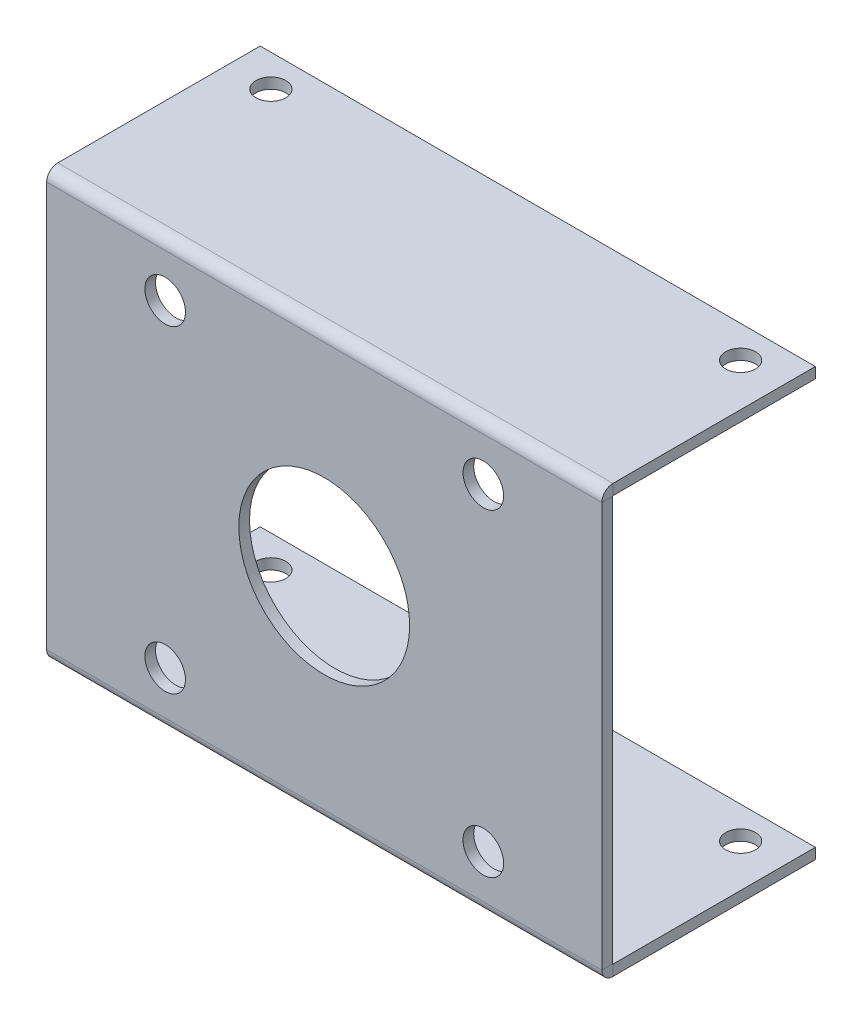
ISO-10303-21;
HEADER;
FILE_DESCRIPTION(('STEP AP214'),'2;1');
FILE_NAME('part.step','',(''),(''),'','','');
FILE_SCHEMA(('AUTOMOTIVE_DESIGN { 1 0 10303 214 1 1 1 1 }'));
ENDSEC;
DATA;
#1=APPLICATION_CONTEXT('core data for automotive mechanical design processes');
#2=APPLICATION_PROTOCOL_DEFINITION('international standard','automotive_design',2000,#1);
#3=PRODUCT_CONTEXT('',#1,'mechanical');
#4=PRODUCT('Part','Part','',(#3));
#5=PRODUCT_RELATED_PRODUCT_CATEGORY('part','',(#4));
#6=PRODUCT_DEFINITION_FORMATION('','',#4);
#7=PRODUCT_DEFINITION_CONTEXT('part definition',#1,'design');
#8=PRODUCT_DEFINITION('design','',#6,#7);
#9=PRODUCT_DEFINITION_SHAPE('','',#8);
#10=(LENGTH_UNIT() NAMED_UNIT(*) SI_UNIT(.MILLI.,.METRE.));
#11=(NAMED_UNIT(*) PLANE_ANGLE_UNIT() SI_UNIT($,.RADIAN.));
#12=(NAMED_UNIT(*) SI_UNIT($,.STERADIAN.) SOLID_ANGLE_UNIT());
#13=UNCERTAINTY_MEASURE_WITH_UNIT(LENGTH_MEASURE(1.E-05),#10,'distance_accuracy_value','');
#14=(GEOMETRIC_REPRESENTATION_CONTEXT(3) GLOBAL_UNCERTAINTY_ASSIGNED_CONTEXT((#13)) GLOBAL_UNIT_ASSIGNED_CONTEXT((#10,
#11,#12)) REPRESENTATION_CONTEXT('',''));
#15=CARTESIAN_POINT('',(0.,0.,0.));
#16=DIRECTION('',(0.,0.,1.));
#17=DIRECTION('',(1.,0.,0.));
#18=AXIS2_PLACEMENT_3D('',#15,#16,#17);
#19=CARTESIAN_POINT('',(0.,0.,-5.));
#20=DIRECTION('',(0.,0.,-1.));
#21=DIRECTION('',(-1.,0.,0.));
#22=AXIS2_PLACEMENT_3D('',#19,#20,#21);
#23=PLANE('',#22);
#24=CARTESIAN_POINT('',(74.5,-74.5,-5.));
#25=DIRECTION('',(0.,0.,-1.));
#26=DIRECTION('',(-1.,0.,0.));
#27=AXIS2_PLACEMENT_3D('',#24,#25,#26);
#28=CIRCLE('',#27,9.49999999999999);
#29=CARTESIAN_POINT('',(65.,-74.5,-5.));
#30=VERTEX_POINT('',#29);
#31=EDGE_CURVE('E297',#30,#30,#28,.T.);
#32=ORIENTED_EDGE('',*,*,#31,.F.);
#33=EDGE_LOOP('',(#32));
#34=FACE_BOUND('',#33,.T.);
#35=CARTESIAN_POINT('',(-74.5,-74.5,-5.));
#36=DIRECTION('',(0.,0.,-1.));
#37=DIRECTION('',(-1.,0.,0.));
#38=AXIS2_PLACEMENT_3D('',#35,#36,#37);
#39=CIRCLE('',#38,9.49999999999999);
#40=CARTESIAN_POINT('',(-84.,-74.5,-5.));
#41=VERTEX_POINT('',#40);
#42=EDGE_CURVE('E310',#41,#41,#39,.T.);
#43=ORIENTED_EDGE('',*,*,#42,.F.);
#44=EDGE_LOOP('',(#43));
#45=FACE_BOUND('',#44,.T.);
#46=CARTESIAN_POINT('',(-74.5,74.5,-5.));
#47=DIRECTION('',(0.,0.,-1.));
#48=DIRECTION('',(-1.,0.,0.));
#49=AXIS2_PLACEMENT_3D('',#46,#47,#48);
#50=CIRCLE('',#49,9.49999999999999);
#51=CARTESIAN_POINT('',(-84.,74.5,-5.));
#52=VERTEX_POINT('',#51);
#53=EDGE_CURVE('E306',#52,#52,#50,.T.);
#54=ORIENTED_EDGE('',*,*,#53,.F.);
#55=EDGE_LOOP('',(#54));
#56=FACE_BOUND('',#55,.T.);
#57=CARTESIAN_POINT('',(74.5,74.5,-5.));
#58=DIRECTION('',(0.,0.,-1.));
#59=DIRECTION('',(-1.,0.,0.));
#60=AXIS2_PLACEMENT_3D('',#57,#58,#59);
#61=CIRCLE('',#60,9.49999999999999);
#62=CARTESIAN_POINT('',(65.,74.5,-5.));
#63=VERTEX_POINT('',#62);
#64=EDGE_CURVE('E301',#63,#63,#61,.T.);
#65=ORIENTED_EDGE('',*,*,#64,.F.);
#66=EDGE_LOOP('',(#65));
#67=FACE_BOUND('',#66,.T.);
#68=CARTESIAN_POINT('',(0.,0.,-5.));
#69=DIRECTION('',(0.,0.,-1.));
#70=DIRECTION('',(-1.,0.,0.));
#71=AXIS2_PLACEMENT_3D('',#68,#69,#70);
#72=CIRCLE('',#71,40.);
#73=CARTESIAN_POINT('',(-40.,0.,-5.));
#74=VERTEX_POINT('',#73);
#75=EDGE_CURVE('E213',#74,#74,#72,.T.);
#76=ORIENTED_EDGE('',*,*,#75,.F.);
#77=EDGE_LOOP('',(#76));
#78=FACE_BOUND('',#77,.T.);
#79=DIRECTION('',(0.,1.,0.));
#80=VECTOR('',#79,1.);
#81=CARTESIAN_POINT('',(130.,-100.,-5.));
#82=LINE('',#81,#80);
#83=CARTESIAN_POINT('',(130.,-94.8,-5.00000000000001));
#84=VERTEX_POINT('',#83);
#85=CARTESIAN_POINT('',(130.,94.8,-5.));
#86=VERTEX_POINT('',#85);
#87=EDGE_CURVE('E88',#84,#86,#82,.T.);
#88=ORIENTED_EDGE('',*,*,#87,.F.);
#89=DIRECTION('',(-1.,0.,0.));
#90=VECTOR('',#89,1.);
#91=CARTESIAN_POINT('',(-130.,-94.8,-5.00000000000001));
#92=LINE('',#91,#90);
#93=CARTESIAN_POINT('',(-130.,-94.8,-5.00000000000001));
#94=VERTEX_POINT('',#93);
#95=EDGE_CURVE('E226',#94,#84,#92,.F.);
#96=ORIENTED_EDGE('',*,*,#95,.F.);
#97=DIRECTION('',(0.,-1.,0.));
#98=VECTOR('',#97,1.);
#99=CARTESIAN_POINT('',(-130.,-100.,-5.));
#100=LINE('',#99,#98);
#101=CARTESIAN_POINT('',(-130.,94.8,-5.));
#102=VERTEX_POINT('',#101);
#103=EDGE_CURVE('E13',#102,#94,#100,.T.);
#104=ORIENTED_EDGE('',*,*,#103,.F.);
#105=DIRECTION('',(1.,0.,0.));
#106=VECTOR('',#105,1.);
#107=CARTESIAN_POINT('',(130.,94.8,-5.00000000000001));
#108=LINE('',#107,#106);
#109=EDGE_CURVE('E282',#86,#102,#108,.F.);
#110=ORIENTED_EDGE('',*,*,#109,.F.);
#111=EDGE_LOOP('',(#88,#96,#104,#110));
#112=FACE_BOUND('',#111,.T.);
#113=ADVANCED_FACE('F79',(#34,#45,#56,#67,#78,#112),#23,.T.);
#114=CARTESIAN_POINT('',(0.,0.,0.));
#115=DIRECTION('',(0.,0.,-1.));
#116=DIRECTION('',(-1.,0.,0.));
#117=AXIS2_PLACEMENT_3D('',#114,#115,#116);
#118=PLANE('',#117);
#119=CARTESIAN_POINT('',(74.5,-74.5,0.));
#120=DIRECTION('',(0.,0.,-1.));
#121=DIRECTION('',(-1.,0.,0.));
#122=AXIS2_PLACEMENT_3D('',#119,#120,#121);
#123=CIRCLE('',#122,9.49999999999999);
#124=CARTESIAN_POINT('',(65.,-74.5,0.));
#125=VERTEX_POINT('',#124);
#126=EDGE_CURVE('E311',#125,#125,#123,.T.);
#127=ORIENTED_EDGE('',*,*,#126,.T.);
#128=EDGE_LOOP('',(#127));
#129=FACE_BOUND('',#128,.T.);
#130=CARTESIAN_POINT('',(-74.5,-74.5,0.));
#131=DIRECTION('',(0.,0.,-1.));
#132=DIRECTION('',(-1.,0.,0.));
#133=AXIS2_PLACEMENT_3D('',#130,#131,#132);
#134=CIRCLE('',#133,9.49999999999999);
#135=CARTESIAN_POINT('',(-84.,-74.5,0.));
#136=VERTEX_POINT('',#135);
#137=EDGE_CURVE('E307',#136,#136,#134,.T.);
#138=ORIENTED_EDGE('',*,*,#137,.T.);
#139=EDGE_LOOP('',(#138));
#140=FACE_BOUND('',#139,.T.);
#141=CARTESIAN_POINT('',(-74.5,74.5,0.));
#142=DIRECTION('',(0.,0.,-1.));
#143=DIRECTION('',(-1.,0.,0.));
#144=AXIS2_PLACEMENT_3D('',#141,#142,#143);
#145=CIRCLE('',#144,9.49999999999999);
#146=CARTESIAN_POINT('',(-84.,74.5,0.));
#147=VERTEX_POINT('',#146);
#148=EDGE_CURVE('E303',#147,#147,#145,.T.);
#149=ORIENTED_EDGE('',*,*,#148,.T.);
#150=EDGE_LOOP('',(#149));
#151=FACE_BOUND('',#150,.T.);
#152=CARTESIAN_POINT('',(74.5,74.5,0.));
#153=DIRECTION('',(0.,0.,-1.));
#154=DIRECTION('',(-1.,0.,0.));
#155=AXIS2_PLACEMENT_3D('',#152,#153,#154);
#156=CIRCLE('',#155,9.49999999999999);
#157=CARTESIAN_POINT('',(65.,74.5,0.));
#158=VERTEX_POINT('',#157);
#159=EDGE_CURVE('E298',#158,#158,#156,.T.);
#160=ORIENTED_EDGE('',*,*,#159,.T.);
#161=EDGE_LOOP('',(#160));
#162=FACE_BOUND('',#161,.T.);
#163=CARTESIAN_POINT('',(0.,0.,0.));
#164=DIRECTION('',(0.,0.,-1.));
#165=DIRECTION('',(-1.,0.,0.));
#166=AXIS2_PLACEMENT_3D('',#163,#164,#165);
#167=CIRCLE('',#166,40.);
#168=CARTESIAN_POINT('',(-40.,0.,0.));
#169=VERTEX_POINT('',#168);
#170=EDGE_CURVE('E294',#169,#169,#167,.T.);
#171=ORIENTED_EDGE('',*,*,#170,.T.);
#172=EDGE_LOOP('',(#171));
#173=FACE_BOUND('',#172,.T.);
#174=DIRECTION('',(-1.,0.,0.));
#175=VECTOR('',#174,1.);
#176=CARTESIAN_POINT('',(-130.,-94.8,0.));
#177=LINE('',#176,#175);
#178=CARTESIAN_POINT('',(-130.,-94.8,0.));
#179=VERTEX_POINT('',#178);
#180=CARTESIAN_POINT('',(130.,-94.8,0.));
#181=VERTEX_POINT('',#180);
#182=EDGE_CURVE('E214',#179,#181,#177,.F.);
#183=ORIENTED_EDGE('',*,*,#182,.T.);
#184=DIRECTION('',(0.,1.,0.));
#185=VECTOR('',#184,1.);
#186=CARTESIAN_POINT('',(130.,-100.,0.));
#187=LINE('',#186,#185);
#188=CARTESIAN_POINT('',(130.,94.8,0.));
#189=VERTEX_POINT('',#188);
#190=EDGE_CURVE('E288',#181,#189,#187,.T.);
#191=ORIENTED_EDGE('',*,*,#190,.T.);
#192=DIRECTION('',(1.,0.,0.));
#193=VECTOR('',#192,1.);
#194=CARTESIAN_POINT('',(130.,94.8,0.));
#195=LINE('',#194,#193);
#196=CARTESIAN_POINT('',(-130.,94.8,0.));
#197=VERTEX_POINT('',#196);
#198=EDGE_CURVE('E270',#189,#197,#195,.F.);
#199=ORIENTED_EDGE('',*,*,#198,.T.);
#200=DIRECTION('',(0.,-1.,0.));
#201=VECTOR('',#200,1.);
#202=CARTESIAN_POINT('',(-130.,-100.,0.));
#203=LINE('',#202,#201);
#204=EDGE_CURVE('E290',#197,#179,#203,.T.);
#205=ORIENTED_EDGE('',*,*,#204,.T.);
#206=EDGE_LOOP('',(#183,#191,#199,#205));
#207=FACE_BOUND('',#206,.T.);
#208=ADVANCED_FACE('F372',(#129,#140,#151,#162,#173,#207),#118,.F.);
#209=CARTESIAN_POINT('',(-130.,-100.,-5.));
#210=DIRECTION('',(-1.,0.,0.));
#211=DIRECTION('',(0.,0.,1.));
#212=AXIS2_PLACEMENT_3D('',#209,#210,#211);
#213=PLANE('',#212);
#214=ORIENTED_EDGE('',*,*,#103,.T.);
#215=DIRECTION('',(0.,0.,1.));
#216=VECTOR('',#215,1.);
#217=CARTESIAN_POINT('',(-130.,-94.8,-5.00000000000001));
#218=LINE('',#217,#216);
#219=EDGE_CURVE('E220',#94,#179,#218,.T.);
#220=ORIENTED_EDGE('',*,*,#219,.T.);
#221=ORIENTED_EDGE('',*,*,#204,.F.);
#222=DIRECTION('',(0.,0.,1.));
#223=VECTOR('',#222,1.);
#224=CARTESIAN_POINT('',(-130.,94.8,-5.00000000000001));
#225=LINE('',#224,#223);
#226=EDGE_CURVE('E95',#102,#197,#225,.T.);
#227=ORIENTED_EDGE('',*,*,#226,.F.);
#228=EDGE_LOOP('',(#214,#220,#221,#227));
#229=FACE_BOUND('',#228,.T.);
#230=ADVANCED_FACE('F378',(#229),#213,.T.);
#231=CARTESIAN_POINT('',(130.,-100.,-5.));
#232=DIRECTION('',(1.,0.,0.));
#233=DIRECTION('',(0.,0.,-1.));
#234=AXIS2_PLACEMENT_3D('',#231,#232,#233);
#235=PLANE('',#234);
#236=DIRECTION('',(0.,0.,1.));
#237=VECTOR('',#236,1.);
#238=CARTESIAN_POINT('',(130.,-94.8,-5.00000000000001));
#239=LINE('',#238,#237);
#240=EDGE_CURVE('E232',#84,#181,#239,.T.);
#241=ORIENTED_EDGE('',*,*,#240,.F.);
#242=ORIENTED_EDGE('',*,*,#87,.T.);
#243=DIRECTION('',(0.,0.,1.));
#244=VECTOR('',#243,1.);
#245=CARTESIAN_POINT('',(130.,94.8,-5.00000000000001));
#246=LINE('',#245,#244);
#247=EDGE_CURVE('E276',#86,#189,#246,.T.);
#248=ORIENTED_EDGE('',*,*,#247,.T.);
#249=ORIENTED_EDGE('',*,*,#190,.F.);
#250=EDGE_LOOP('',(#241,#242,#248,#249));
#251=FACE_BOUND('',#250,.T.);
#252=ADVANCED_FACE('F81',(#251),#235,.T.);
#253=CARTESIAN_POINT('',(-130.,94.8,-5.20000000000001));
#254=DIRECTION('',(-1.,0.,0.));
#255=DIRECTION('',(0.,0.,1.));
#256=AXIS2_PLACEMENT_3D('',#253,#254,#255);
#257=PLANE('',#256);
#258=DIRECTION('',(0.,1.,0.));
#259=VECTOR('',#258,1.);
#260=CARTESIAN_POINT('',(-130.,100.,-5.2));
#261=LINE('',#260,#259);
#262=CARTESIAN_POINT('',(-130.,95.,-5.20000000000001));
#263=VERTEX_POINT('',#262);
#264=CARTESIAN_POINT('',(-130.,100.,-5.19999999999999));
#265=VERTEX_POINT('',#264);
#266=EDGE_CURVE('E235',#263,#265,#261,.T.);
#267=ORIENTED_EDGE('',*,*,#266,.F.);
#268=CARTESIAN_POINT('',(-130.,94.8,-5.20000000000001));
#269=DIRECTION('',(1.,0.,0.));
#270=DIRECTION('',(0.,0.,-1.));
#271=AXIS2_PLACEMENT_3D('',#268,#269,#270);
#272=CIRCLE('',#271,0.200000000000006);
#273=EDGE_CURVE('E279',#102,#263,#272,.F.);
#274=ORIENTED_EDGE('',*,*,#273,.F.);
#275=ORIENTED_EDGE('',*,*,#226,.T.);
#276=CARTESIAN_POINT('',(-130.,94.8,-5.20000000000001));
#277=DIRECTION('',(1.,0.,0.));
#278=DIRECTION('',(0.,0.,-1.));
#279=AXIS2_PLACEMENT_3D('',#276,#277,#278);
#280=CIRCLE('',#279,5.20000000000001);
#281=EDGE_CURVE('E272',#197,#265,#280,.F.);
#282=ORIENTED_EDGE('',*,*,#281,.T.);
#283=EDGE_LOOP('',(#267,#274,#275,#282));
#284=FACE_BOUND('',#283,.T.);
#285=ADVANCED_FACE('F390',(#284),#257,.T.);
#286=CARTESIAN_POINT('',(130.,94.8,-5.20000000000001));
#287=DIRECTION('',(-1.,0.,0.));
#288=DIRECTION('',(0.,0.,1.));
#289=AXIS2_PLACEMENT_3D('',#286,#287,#288);
#290=PLANE('',#289);
#291=CARTESIAN_POINT('',(130.,94.8,-5.20000000000001));
#292=DIRECTION('',(1.,0.,0.));
#293=DIRECTION('',(0.,0.,-1.));
#294=AXIS2_PLACEMENT_3D('',#291,#292,#293);
#295=CIRCLE('',#294,0.200000000000006);
#296=CARTESIAN_POINT('',(130.,95.,-5.20000000000001));
#297=VERTEX_POINT('',#296);
#298=EDGE_CURVE('E240',#297,#86,#295,.T.);
#299=ORIENTED_EDGE('',*,*,#298,.F.);
#300=DIRECTION('',(0.,1.,0.));
#301=VECTOR('',#300,1.);
#302=CARTESIAN_POINT('',(130.,95.,-5.20000000000001));
#303=LINE('',#302,#301);
#304=CARTESIAN_POINT('',(130.,100.,-5.19999999999999));
#305=VERTEX_POINT('',#304);
#306=EDGE_CURVE('E263',#297,#305,#303,.T.);
#307=ORIENTED_EDGE('',*,*,#306,.T.);
#308=CARTESIAN_POINT('',(130.,94.8,-5.20000000000001));
#309=DIRECTION('',(1.,0.,0.));
#310=DIRECTION('',(0.,0.,-1.));
#311=AXIS2_PLACEMENT_3D('',#308,#309,#310);
#312=CIRCLE('',#311,5.20000000000001);
#313=EDGE_CURVE('E273',#305,#189,#312,.T.);
#314=ORIENTED_EDGE('',*,*,#313,.T.);
#315=ORIENTED_EDGE('',*,*,#247,.F.);
#316=EDGE_LOOP('',(#299,#307,#314,#315));
#317=FACE_BOUND('',#316,.T.);
#318=ADVANCED_FACE('F384',(#317),#290,.F.);
#319=CARTESIAN_POINT('',(130.,94.8,-5.20000000000001));
#320=DIRECTION('',(1.,0.,0.));
#321=DIRECTION('',(0.,1.,0.));
#322=AXIS2_PLACEMENT_3D('',#319,#320,#321);
#323=CYLINDRICAL_SURFACE('',#322,5.20000000000001);
#324=ORIENTED_EDGE('',*,*,#198,.F.);
#325=ORIENTED_EDGE('',*,*,#313,.F.);
#326=DIRECTION('',(1.,0.,0.));
#327=VECTOR('',#326,1.);
#328=CARTESIAN_POINT('',(0.,100.,-5.19999999999999));
#329=LINE('',#328,#327);
#330=EDGE_CURVE('E260',#265,#305,#329,.T.);
#331=ORIENTED_EDGE('',*,*,#330,.F.);
#332=ORIENTED_EDGE('',*,*,#281,.F.);
#333=EDGE_LOOP('',(#324,#325,#331,#332));
#334=FACE_BOUND('',#333,.T.);
#335=ADVANCED_FACE('F423',(#334),#323,.T.);
#336=CARTESIAN_POINT('',(130.,94.8,-5.20000000000001));
#337=DIRECTION('',(1.,0.,0.));
#338=DIRECTION('',(0.,1.,0.));
#339=AXIS2_PLACEMENT_3D('',#336,#337,#338);
#340=CYLINDRICAL_SURFACE('',#339,0.200000000000006);
#341=ORIENTED_EDGE('',*,*,#109,.T.);
#342=ORIENTED_EDGE('',*,*,#273,.T.);
#343=DIRECTION('',(-1.,0.,0.));
#344=VECTOR('',#343,1.);
#345=CARTESIAN_POINT('',(-130.,95.,-5.20000000000001));
#346=LINE('',#345,#344);
#347=EDGE_CURVE('E266',#263,#297,#346,.F.);
#348=ORIENTED_EDGE('',*,*,#347,.T.);
#349=ORIENTED_EDGE('',*,*,#298,.T.);
#350=EDGE_LOOP('',(#341,#342,#348,#349));
#351=FACE_BOUND('',#350,.T.);
#352=ADVANCED_FACE('F396',(#351),#340,.F.);
#353=CARTESIAN_POINT('',(130.,100.,-4.99999999999998));
#354=DIRECTION('',(1.,0.,0.));
#355=DIRECTION('',(0.,0.,-1.));
#356=AXIS2_PLACEMENT_3D('',#353,#354,#355);
#357=PLANE('',#356);
#358=DIRECTION('',(0.,0.,1.));
#359=VECTOR('',#358,1.);
#360=CARTESIAN_POINT('',(130.,100.,-4.99999999999998));
#361=LINE('',#360,#359);
#362=CARTESIAN_POINT('',(130.,100.,-100.));
#363=VERTEX_POINT('',#362);
#364=EDGE_CURVE('E244',#363,#305,#361,.T.);
#365=ORIENTED_EDGE('',*,*,#364,.T.);
#366=ORIENTED_EDGE('',*,*,#306,.F.);
#367=DIRECTION('',(0.,0.,-1.));
#368=VECTOR('',#367,1.);
#369=CARTESIAN_POINT('',(130.,95.,3.5059674461847E-13));
#370=LINE('',#369,#368);
#371=CARTESIAN_POINT('',(130.,95.0000000000003,-100.));
#372=VERTEX_POINT('',#371);
#373=EDGE_CURVE('E252',#372,#297,#370,.F.);
#374=ORIENTED_EDGE('',*,*,#373,.F.);
#375=DIRECTION('',(0.,-1.,0.));
#376=VECTOR('',#375,1.);
#377=CARTESIAN_POINT('',(130.,100.,-100.));
#378=LINE('',#377,#376);
#379=EDGE_CURVE('E238',#363,#372,#378,.T.);
#380=ORIENTED_EDGE('',*,*,#379,.F.);
#381=EDGE_LOOP('',(#365,#366,#374,#380));
#382=FACE_BOUND('',#381,.T.);
#383=ADVANCED_FACE('F418',(#382),#357,.T.);
#384=CARTESIAN_POINT('',(-130.,100.,-100.));
#385=DIRECTION('',(-1.,0.,0.));
#386=DIRECTION('',(0.,0.,1.));
#387=AXIS2_PLACEMENT_3D('',#384,#385,#386);
#388=PLANE('',#387);
#389=DIRECTION('',(0.,0.,1.));
#390=VECTOR('',#389,1.);
#391=CARTESIAN_POINT('',(-130.,95.,3.5059674461847E-13));
#392=LINE('',#391,#390);
#393=CARTESIAN_POINT('',(-130.,95.0000000000003,-100.));
#394=VERTEX_POINT('',#393);
#395=EDGE_CURVE('E258',#263,#394,#392,.F.);
#396=ORIENTED_EDGE('',*,*,#395,.F.);
#397=ORIENTED_EDGE('',*,*,#266,.T.);
#398=DIRECTION('',(0.,0.,-1.));
#399=VECTOR('',#398,1.);
#400=CARTESIAN_POINT('',(-130.,100.,-100.));
#401=LINE('',#400,#399);
#402=CARTESIAN_POINT('',(-130.,100.,-100.));
#403=VERTEX_POINT('',#402);
#404=EDGE_CURVE('E250',#265,#403,#401,.T.);
#405=ORIENTED_EDGE('',*,*,#404,.T.);
#406=DIRECTION('',(0.,-1.,0.));
#407=VECTOR('',#406,1.);
#408=CARTESIAN_POINT('',(-130.,100.,-100.));
#409=LINE('',#408,#407);
#410=EDGE_CURVE('E241',#403,#394,#409,.T.);
#411=ORIENTED_EDGE('',*,*,#410,.T.);
#412=EDGE_LOOP('',(#396,#397,#405,#411));
#413=FACE_BOUND('',#412,.T.);
#414=ADVANCED_FACE('F404',(#413),#388,.T.);
#415=CARTESIAN_POINT('',(0.,100.,3.68054151312686E-13));
#416=DIRECTION('',(0.,1.,0.));
#417=DIRECTION('',(0.,0.,1.));
#418=AXIS2_PLACEMENT_3D('',#415,#416,#417);
#419=PLANE('',#418);
#420=CARTESIAN_POINT('',(-110.,100.,-85.0000000000007));
#421=DIRECTION('',(0.,-1.,0.));
#422=DIRECTION('',(0.,0.,-1.));
#423=AXIS2_PLACEMENT_3D('',#420,#421,#422);
#424=CIRCLE('',#423,7.);
#425=CARTESIAN_POINT('',(-110.,100.,-92.0000000000007));
#426=VERTEX_POINT('',#425);
#427=EDGE_CURVE('E316',#426,#426,#424,.T.);
#428=ORIENTED_EDGE('',*,*,#427,.T.);
#429=EDGE_LOOP('',(#428));
#430=FACE_BOUND('',#429,.T.);
#431=CARTESIAN_POINT('',(110.,100.,-85.0000000000007));
#432=DIRECTION('',(0.,-1.,0.));
#433=DIRECTION('',(0.,0.,-1.));
#434=AXIS2_PLACEMENT_3D('',#431,#432,#433);
#435=CIRCLE('',#434,7.);
#436=CARTESIAN_POINT('',(110.,100.,-92.0000000000007));
#437=VERTEX_POINT('',#436);
#438=EDGE_CURVE('E323',#437,#437,#435,.T.);
#439=ORIENTED_EDGE('',*,*,#438,.T.);
#440=EDGE_LOOP('',(#439));
#441=FACE_BOUND('',#440,.T.);
#442=ORIENTED_EDGE('',*,*,#404,.F.);
#443=ORIENTED_EDGE('',*,*,#330,.T.);
#444=ORIENTED_EDGE('',*,*,#364,.F.);
#445=DIRECTION('',(1.,0.,0.));
#446=VECTOR('',#445,1.);
#447=CARTESIAN_POINT('',(130.,100.,-100.));
#448=LINE('',#447,#446);
#449=EDGE_CURVE('E247',#403,#363,#448,.T.);
#450=ORIENTED_EDGE('',*,*,#449,.F.);
#451=EDGE_LOOP('',(#442,#443,#444,#450));
#452=FACE_BOUND('',#451,.T.);
#453=ADVANCED_FACE('F408',(#430,#441,#452),#419,.T.);
#454=CARTESIAN_POINT('',(0.,95.,3.5059674461847E-13));
#455=DIRECTION('',(0.,1.,0.));
#456=DIRECTION('',(0.,0.,1.));
#457=AXIS2_PLACEMENT_3D('',#454,#455,#456);
#458=PLANE('',#457);
#459=CARTESIAN_POINT('',(-110.,95.0000000000003,-85.0000000000007));
#460=DIRECTION('',(0.,1.,0.));
#461=DIRECTION('',(0.,0.,1.));
#462=AXIS2_PLACEMENT_3D('',#459,#460,#461);
#463=CIRCLE('',#462,7.);
#464=CARTESIAN_POINT('',(-110.,95.0000000000003,-78.0000000000007));
#465=VERTEX_POINT('',#464);
#466=EDGE_CURVE('E302',#465,#465,#463,.T.);
#467=ORIENTED_EDGE('',*,*,#466,.T.);
#468=EDGE_LOOP('',(#467));
#469=FACE_BOUND('',#468,.T.);
#470=CARTESIAN_POINT('',(110.,95.0000000000003,-85.0000000000007));
#471=DIRECTION('',(0.,1.,0.));
#472=DIRECTION('',(0.,0.,1.));
#473=AXIS2_PLACEMENT_3D('',#470,#471,#472);
#474=CIRCLE('',#473,7.);
#475=CARTESIAN_POINT('',(110.,95.0000000000003,-78.0000000000007));
#476=VERTEX_POINT('',#475);
#477=EDGE_CURVE('E320',#476,#476,#474,.T.);
#478=ORIENTED_EDGE('',*,*,#477,.T.);
#479=EDGE_LOOP('',(#478));
#480=FACE_BOUND('',#479,.T.);
#481=ORIENTED_EDGE('',*,*,#347,.F.);
#482=ORIENTED_EDGE('',*,*,#395,.T.);
#483=DIRECTION('',(-1.,0.,0.));
#484=VECTOR('',#483,1.);
#485=CARTESIAN_POINT('',(0.,95.0000000000003,-100.));
#486=LINE('',#485,#484);
#487=EDGE_CURVE('E255',#394,#372,#486,.F.);
#488=ORIENTED_EDGE('',*,*,#487,.T.);
#489=ORIENTED_EDGE('',*,*,#373,.T.);
#490=EDGE_LOOP('',(#481,#482,#488,#489));
#491=FACE_BOUND('',#490,.T.);
#492=ADVANCED_FACE('F415',(#469,#480,#491),#458,.F.);
#493=CARTESIAN_POINT('',(130.,100.,-100.));
#494=DIRECTION('',(0.,0.,-1.));
#495=DIRECTION('',(0.,1.,0.));
#496=AXIS2_PLACEMENT_3D('',#493,#494,#495);
#497=PLANE('',#496);
#498=ORIENTED_EDGE('',*,*,#487,.F.);
#499=ORIENTED_EDGE('',*,*,#410,.F.);
#500=ORIENTED_EDGE('',*,*,#449,.T.);
#501=ORIENTED_EDGE('',*,*,#379,.T.);
#502=EDGE_LOOP('',(#498,#499,#500,#501));
#503=FACE_BOUND('',#502,.T.);
#504=ADVANCED_FACE('F412',(#503),#497,.T.);
#505=CARTESIAN_POINT('',(130.,-94.8,-5.20000000000001));
#506=DIRECTION('',(1.,0.,0.));
#507=DIRECTION('',(0.,0.,-1.));
#508=AXIS2_PLACEMENT_3D('',#505,#506,#507);
#509=PLANE('',#508);
#510=DIRECTION('',(0.,1.,0.));
#511=VECTOR('',#510,1.);
#512=CARTESIAN_POINT('',(130.,-100.,-5.19999999999999));
#513=LINE('',#512,#511);
#514=CARTESIAN_POINT('',(130.,-95.,-5.20000000000001));
#515=VERTEX_POINT('',#514);
#516=CARTESIAN_POINT('',(130.,-100.,-5.19999999999999));
#517=VERTEX_POINT('',#516);
#518=EDGE_CURVE('E195',#515,#517,#513,.F.);
#519=ORIENTED_EDGE('',*,*,#518,.F.);
#520=CARTESIAN_POINT('',(130.,-94.8,-5.20000000000001));
#521=DIRECTION('',(-1.,0.,0.));
#522=DIRECTION('',(0.,0.,1.));
#523=AXIS2_PLACEMENT_3D('',#520,#521,#522);
#524=CIRCLE('',#523,0.200000000000006);
#525=EDGE_CURVE('E223',#84,#515,#524,.F.);
#526=ORIENTED_EDGE('',*,*,#525,.F.);
#527=ORIENTED_EDGE('',*,*,#240,.T.);
#528=CARTESIAN_POINT('',(130.,-94.8,-5.20000000000001));
#529=DIRECTION('',(-1.,0.,0.));
#530=DIRECTION('',(0.,0.,1.));
#531=AXIS2_PLACEMENT_3D('',#528,#529,#530);
#532=CIRCLE('',#531,5.20000000000001);
#533=EDGE_CURVE('E216',#181,#517,#532,.F.);
#534=ORIENTED_EDGE('',*,*,#533,.T.);
#535=EDGE_LOOP('',(#519,#526,#527,#534));
#536=FACE_BOUND('',#535,.T.);
#537=ADVANCED_FACE('F428',(#536),#509,.T.);
#538=CARTESIAN_POINT('',(-130.,-94.8,-5.20000000000001));
#539=DIRECTION('',(1.,0.,0.));
#540=DIRECTION('',(0.,0.,-1.));
#541=AXIS2_PLACEMENT_3D('',#538,#539,#540);
#542=PLANE('',#541);
#543=CARTESIAN_POINT('',(-130.,-94.8,-5.20000000000001));
#544=DIRECTION('',(-1.,0.,0.));
#545=DIRECTION('',(0.,0.,1.));
#546=AXIS2_PLACEMENT_3D('',#543,#544,#545);
#547=CIRCLE('',#546,0.200000000000006);
#548=CARTESIAN_POINT('',(-130.,-95.,-5.20000000000001));
#549=VERTEX_POINT('',#548);
#550=EDGE_CURVE('E229',#549,#94,#547,.T.);
#551=ORIENTED_EDGE('',*,*,#550,.F.);
#552=DIRECTION('',(0.,1.,0.));
#553=VECTOR('',#552,1.);
#554=CARTESIAN_POINT('',(-130.,-95.,-5.20000000000001));
#555=LINE('',#554,#553);
#556=CARTESIAN_POINT('',(-130.,-100.,-5.19999999999999));
#557=VERTEX_POINT('',#556);
#558=EDGE_CURVE('E207',#549,#557,#555,.F.);
#559=ORIENTED_EDGE('',*,*,#558,.T.);
#560=CARTESIAN_POINT('',(-130.,-94.8,-5.20000000000001));
#561=DIRECTION('',(-1.,0.,0.));
#562=DIRECTION('',(0.,0.,1.));
#563=AXIS2_PLACEMENT_3D('',#560,#561,#562);
#564=CIRCLE('',#563,5.20000000000001);
#565=EDGE_CURVE('E217',#557,#179,#564,.T.);
#566=ORIENTED_EDGE('',*,*,#565,.T.);
#567=ORIENTED_EDGE('',*,*,#219,.F.);
#568=EDGE_LOOP('',(#551,#559,#566,#567));
#569=FACE_BOUND('',#568,.T.);
#570=ADVANCED_FACE('F358',(#569),#542,.F.);
#571=CARTESIAN_POINT('',(-130.,-94.8,-5.20000000000001));
#572=DIRECTION('',(-1.,0.,0.));
#573=DIRECTION('',(0.,-1.,0.));
#574=AXIS2_PLACEMENT_3D('',#571,#572,#573);
#575=CYLINDRICAL_SURFACE('',#574,5.20000000000001);
#576=ORIENTED_EDGE('',*,*,#182,.F.);
#577=ORIENTED_EDGE('',*,*,#565,.F.);
#578=DIRECTION('',(-1.,0.,0.));
#579=VECTOR('',#578,1.);
#580=CARTESIAN_POINT('',(130.,-100.,-5.19999999999999));
#581=LINE('',#580,#579);
#582=EDGE_CURVE('E205',#557,#517,#581,.F.);
#583=ORIENTED_EDGE('',*,*,#582,.T.);
#584=ORIENTED_EDGE('',*,*,#533,.F.);
#585=EDGE_LOOP('',(#576,#577,#583,#584));
#586=FACE_BOUND('',#585,.T.);
#587=ADVANCED_FACE('F367',(#586),#575,.T.);
#588=CARTESIAN_POINT('',(-130.,-94.8,-5.20000000000001));
#589=DIRECTION('',(-1.,0.,0.));
#590=DIRECTION('',(0.,-1.,0.));
#591=AXIS2_PLACEMENT_3D('',#588,#589,#590);
#592=CYLINDRICAL_SURFACE('',#591,0.200000000000006);
#593=ORIENTED_EDGE('',*,*,#95,.T.);
#594=ORIENTED_EDGE('',*,*,#525,.T.);
#595=DIRECTION('',(-1.,0.,0.));
#596=VECTOR('',#595,1.);
#597=CARTESIAN_POINT('',(130.,-95.,-5.20000000000001));
#598=LINE('',#597,#596);
#599=EDGE_CURVE('E210',#515,#549,#598,.T.);
#600=ORIENTED_EDGE('',*,*,#599,.T.);
#601=ORIENTED_EDGE('',*,*,#550,.T.);
#602=EDGE_LOOP('',(#593,#594,#600,#601));
#603=FACE_BOUND('',#602,.T.);
#604=ADVANCED_FACE('F353',(#603),#592,.F.);
#605=CARTESIAN_POINT('',(-130.,-100.,-100.));
#606=DIRECTION('',(1.,0.,0.));
#607=DIRECTION('',(0.,0.,-1.));
#608=AXIS2_PLACEMENT_3D('',#605,#606,#607);
#609=PLANE('',#608);
#610=ORIENTED_EDGE('',*,*,#558,.F.);
#611=DIRECTION('',(0.,0.,1.));
#612=VECTOR('',#611,1.);
#613=CARTESIAN_POINT('',(-130.,-95.0000000000003,-100.));
#614=LINE('',#613,#612);
#615=CARTESIAN_POINT('',(-130.,-95.0000000000003,-100.));
#616=VERTEX_POINT('',#615);
#617=EDGE_CURVE('E203',#549,#616,#614,.F.);
#618=ORIENTED_EDGE('',*,*,#617,.T.);
#619=DIRECTION('',(0.,1.,0.));
#620=VECTOR('',#619,1.);
#621=CARTESIAN_POINT('',(-130.,-100.,-100.));
#622=LINE('',#621,#620);
#623=CARTESIAN_POINT('',(-130.,-100.,-100.));
#624=VERTEX_POINT('',#623);
#625=EDGE_CURVE('E191',#624,#616,#622,.T.);
#626=ORIENTED_EDGE('',*,*,#625,.F.);
#627=DIRECTION('',(0.,0.,-1.));
#628=VECTOR('',#627,1.);
#629=CARTESIAN_POINT('',(-130.,-100.,3.68054151312686E-13));
#630=LINE('',#629,#628);
#631=EDGE_CURVE('E178',#557,#624,#630,.T.);
#632=ORIENTED_EDGE('',*,*,#631,.F.);
#633=EDGE_LOOP('',(#610,#618,#626,#632));
#634=FACE_BOUND('',#633,.T.);
#635=ADVANCED_FACE('F359',(#634),#609,.F.);
#636=CARTESIAN_POINT('',(130.,-100.,-4.99999999999998));
#637=DIRECTION('',(-1.,0.,0.));
#638=DIRECTION('',(0.,0.,1.));
#639=AXIS2_PLACEMENT_3D('',#636,#637,#638);
#640=PLANE('',#639);
#641=ORIENTED_EDGE('',*,*,#518,.T.);
#642=DIRECTION('',(0.,0.,1.));
#643=VECTOR('',#642,1.);
#644=CARTESIAN_POINT('',(130.,-100.,3.68054151312686E-13));
#645=LINE('',#644,#643);
#646=CARTESIAN_POINT('',(130.,-100.,-100.));
#647=VERTEX_POINT('',#646);
#648=EDGE_CURVE('E176',#647,#517,#645,.T.);
#649=ORIENTED_EDGE('',*,*,#648,.F.);
#650=DIRECTION('',(0.,1.,0.));
#651=VECTOR('',#650,1.);
#652=CARTESIAN_POINT('',(130.,-100.,-100.));
#653=LINE('',#652,#651);
#654=CARTESIAN_POINT('',(130.,-95.0000000000003,-100.));
#655=VERTEX_POINT('',#654);
#656=EDGE_CURVE('E184',#647,#655,#653,.T.);
#657=ORIENTED_EDGE('',*,*,#656,.T.);
#658=DIRECTION('',(0.,0.,-1.));
#659=VECTOR('',#658,1.);
#660=CARTESIAN_POINT('',(130.,-95.,-5.));
#661=LINE('',#660,#659);
#662=EDGE_CURVE('E200',#655,#515,#661,.F.);
#663=ORIENTED_EDGE('',*,*,#662,.T.);
#664=EDGE_LOOP('',(#641,#649,#657,#663));
#665=FACE_BOUND('',#664,.T.);
#666=ADVANCED_FACE('F194',(#665),#640,.F.);
#667=CARTESIAN_POINT('',(0.,-100.,3.68054151312686E-13));
#668=DIRECTION('',(0.,1.,0.));
#669=DIRECTION('',(0.,0.,1.));
#670=AXIS2_PLACEMENT_3D('',#667,#668,#669);
#671=PLANE('',#670);
#672=CARTESIAN_POINT('',(-110.,-100.,-85.));
#673=DIRECTION('',(0.,1.,0.));
#674=DIRECTION('',(0.,0.,1.));
#675=AXIS2_PLACEMENT_3D('',#672,#673,#674);
#676=CIRCLE('',#675,7.);
#677=CARTESIAN_POINT('',(-110.,-100.,-78.));
#678=VERTEX_POINT('',#677);
#679=EDGE_CURVE('E332',#678,#678,#676,.T.);
#680=ORIENTED_EDGE('',*,*,#679,.T.);
#681=EDGE_LOOP('',(#680));
#682=FACE_BOUND('',#681,.T.);
#683=CARTESIAN_POINT('',(110.,-100.,-85.));
#684=DIRECTION('',(0.,1.,0.));
#685=DIRECTION('',(0.,0.,1.));
#686=AXIS2_PLACEMENT_3D('',#683,#684,#685);
#687=CIRCLE('',#686,7.);
#688=CARTESIAN_POINT('',(110.,-100.,-78.));
#689=VERTEX_POINT('',#688);
#690=EDGE_CURVE('E315',#689,#689,#687,.T.);
#691=ORIENTED_EDGE('',*,*,#690,.T.);
#692=EDGE_LOOP('',(#691));
#693=FACE_BOUND('',#692,.T.);
#694=ORIENTED_EDGE('',*,*,#582,.F.);
#695=ORIENTED_EDGE('',*,*,#631,.T.);
#696=DIRECTION('',(1.,0.,0.));
#697=VECTOR('',#696,1.);
#698=CARTESIAN_POINT('',(0.,-100.,-100.));
#699=LINE('',#698,#697);
#700=EDGE_CURVE('E171',#624,#647,#699,.T.);
#701=ORIENTED_EDGE('',*,*,#700,.T.);
#702=ORIENTED_EDGE('',*,*,#648,.T.);
#703=EDGE_LOOP('',(#694,#695,#701,#702));
#704=FACE_BOUND('',#703,.T.);
#705=ADVANCED_FACE('F174',(#682,#693,#704),#671,.F.);
#706=CARTESIAN_POINT('',(0.,-95.,3.5059674461847E-13));
#707=DIRECTION('',(0.,1.,0.));
#708=DIRECTION('',(0.,0.,1.));
#709=AXIS2_PLACEMENT_3D('',#706,#707,#708);
#710=PLANE('',#709);
#711=CARTESIAN_POINT('',(-110.,-95.0000000000003,-85.));
#712=DIRECTION('',(0.,1.,0.));
#713=DIRECTION('',(0.,0.,1.));
#714=AXIS2_PLACEMENT_3D('',#711,#712,#713);
#715=CIRCLE('',#714,7.);
#716=CARTESIAN_POINT('',(-110.,-95.0000000000003,-78.));
#717=VERTEX_POINT('',#716);
#718=EDGE_CURVE('E83',#717,#717,#715,.T.);
#719=ORIENTED_EDGE('',*,*,#718,.F.);
#720=EDGE_LOOP('',(#719));
#721=FACE_BOUND('',#720,.T.);
#722=CARTESIAN_POINT('',(110.,-95.0000000000003,-85.));
#723=DIRECTION('',(0.,1.,0.));
#724=DIRECTION('',(0.,0.,1.));
#725=AXIS2_PLACEMENT_3D('',#722,#723,#724);
#726=CIRCLE('',#725,7.);
#727=CARTESIAN_POINT('',(110.,-95.0000000000003,-78.));
#728=VERTEX_POINT('',#727);
#729=EDGE_CURVE('E313',#728,#728,#726,.T.);
#730=ORIENTED_EDGE('',*,*,#729,.F.);
#731=EDGE_LOOP('',(#730));
#732=FACE_BOUND('',#731,.T.);
#733=ORIENTED_EDGE('',*,*,#617,.F.);
#734=ORIENTED_EDGE('',*,*,#599,.F.);
#735=ORIENTED_EDGE('',*,*,#662,.F.);
#736=DIRECTION('',(-1.,0.,0.));
#737=VECTOR('',#736,1.);
#738=CARTESIAN_POINT('',(130.,-95.0000000000003,-100.));
#739=LINE('',#738,#737);
#740=EDGE_CURVE('E187',#616,#655,#739,.F.);
#741=ORIENTED_EDGE('',*,*,#740,.F.);
#742=EDGE_LOOP('',(#733,#734,#735,#741));
#743=FACE_BOUND('',#742,.T.);
#744=ADVANCED_FACE('F349',(#721,#732,#743),#710,.T.);
#745=CARTESIAN_POINT('',(130.,-100.,-100.));
#746=DIRECTION('',(0.,0.,1.));
#747=DIRECTION('',(0.,-1.,0.));
#748=AXIS2_PLACEMENT_3D('',#745,#746,#747);
#749=PLANE('',#748);
#750=ORIENTED_EDGE('',*,*,#740,.T.);
#751=ORIENTED_EDGE('',*,*,#656,.F.);
#752=ORIENTED_EDGE('',*,*,#700,.F.);
#753=ORIENTED_EDGE('',*,*,#625,.T.);
#754=EDGE_LOOP('',(#750,#751,#752,#753));
#755=FACE_BOUND('',#754,.T.);
#756=ADVANCED_FACE('F185',(#755),#749,.F.);
#757=CARTESIAN_POINT('',(0.,0.,-100.));
#758=DIRECTION('',(0.,0.,1.));
#759=DIRECTION('',(1.,0.,0.));
#760=AXIS2_PLACEMENT_3D('',#757,#758,#759);
#761=CYLINDRICAL_SURFACE('',#760,40.);
#762=ORIENTED_EDGE('',*,*,#75,.T.);
#763=EDGE_LOOP('',(#762));
#764=FACE_BOUND('',#763,.T.);
#765=ORIENTED_EDGE('',*,*,#170,.F.);
#766=EDGE_LOOP('',(#765));
#767=FACE_BOUND('',#766,.T.);
#768=ADVANCED_FACE('F550',(#764,#767),#761,.F.);
#769=CARTESIAN_POINT('',(74.5,74.5,-100.));
#770=DIRECTION('',(0.,0.,1.));
#771=DIRECTION('',(1.,0.,0.));
#772=AXIS2_PLACEMENT_3D('',#769,#770,#771);
#773=CYLINDRICAL_SURFACE('',#772,9.49999999999999);
#774=ORIENTED_EDGE('',*,*,#64,.T.);
#775=EDGE_LOOP('',(#774));
#776=FACE_BOUND('',#775,.T.);
#777=ORIENTED_EDGE('',*,*,#159,.F.);
#778=EDGE_LOOP('',(#777));
#779=FACE_BOUND('',#778,.T.);
#780=ADVANCED_FACE('F560',(#776,#779),#773,.F.);
#781=CARTESIAN_POINT('',(-74.5,74.5,-100.));
#782=DIRECTION('',(0.,0.,1.));
#783=DIRECTION('',(1.,0.,0.));
#784=AXIS2_PLACEMENT_3D('',#781,#782,#783);
#785=CYLINDRICAL_SURFACE('',#784,9.49999999999999);
#786=ORIENTED_EDGE('',*,*,#53,.T.);
#787=EDGE_LOOP('',(#786));
#788=FACE_BOUND('',#787,.T.);
#789=ORIENTED_EDGE('',*,*,#148,.F.);
#790=EDGE_LOOP('',(#789));
#791=FACE_BOUND('',#790,.T.);
#792=ADVANCED_FACE('F582',(#788,#791),#785,.F.);
#793=CARTESIAN_POINT('',(-74.5,-74.5,-100.));
#794=DIRECTION('',(0.,0.,1.));
#795=DIRECTION('',(1.,0.,0.));
#796=AXIS2_PLACEMENT_3D('',#793,#794,#795);
#797=CYLINDRICAL_SURFACE('',#796,9.49999999999999);
#798=ORIENTED_EDGE('',*,*,#42,.T.);
#799=EDGE_LOOP('',(#798));
#800=FACE_BOUND('',#799,.T.);
#801=ORIENTED_EDGE('',*,*,#137,.F.);
#802=EDGE_LOOP('',(#801));
#803=FACE_BOUND('',#802,.T.);
#804=ADVANCED_FACE('F593',(#800,#803),#797,.F.);
#805=CARTESIAN_POINT('',(74.5,-74.5,-100.));
#806=DIRECTION('',(0.,0.,1.));
#807=DIRECTION('',(1.,0.,0.));
#808=AXIS2_PLACEMENT_3D('',#805,#806,#807);
#809=CYLINDRICAL_SURFACE('',#808,9.49999999999999);
#810=ORIENTED_EDGE('',*,*,#31,.T.);
#811=EDGE_LOOP('',(#810));
#812=FACE_BOUND('',#811,.T.);
#813=ORIENTED_EDGE('',*,*,#126,.F.);
#814=EDGE_LOOP('',(#813));
#815=FACE_BOUND('',#814,.T.);
#816=ADVANCED_FACE('F603',(#812,#815),#809,.F.);
#817=CARTESIAN_POINT('',(110.,100.,-85.0000000000007));
#818=DIRECTION('',(0.,-1.,0.));
#819=DIRECTION('',(0.,0.,-1.));
#820=AXIS2_PLACEMENT_3D('',#817,#818,#819);
#821=CYLINDRICAL_SURFACE('',#820,7.);
#822=ORIENTED_EDGE('',*,*,#729,.T.);
#823=EDGE_LOOP('',(#822));
#824=FACE_BOUND('',#823,.T.);
#825=ORIENTED_EDGE('',*,*,#690,.F.);
#826=EDGE_LOOP('',(#825));
#827=FACE_BOUND('',#826,.T.);
#828=ADVANCED_FACE('F613',(#824,#827),#821,.F.);
#829=CARTESIAN_POINT('',(-110.,100.,-85.0000000000007));
#830=DIRECTION('',(0.,-1.,0.));
#831=DIRECTION('',(0.,0.,-1.));
#832=AXIS2_PLACEMENT_3D('',#829,#830,#831);
#833=CYLINDRICAL_SURFACE('',#832,7.);
#834=ORIENTED_EDGE('',*,*,#718,.T.);
#835=EDGE_LOOP('',(#834));
#836=FACE_BOUND('',#835,.T.);
#837=ORIENTED_EDGE('',*,*,#679,.F.);
#838=EDGE_LOOP('',(#837));
#839=FACE_BOUND('',#838,.T.);
#840=ADVANCED_FACE('F625',(#836,#839),#833,.F.);
#841=ORIENTED_EDGE('',*,*,#438,.F.);
#842=EDGE_LOOP('',(#841));
#843=FACE_BOUND('',#842,.T.);
#844=ORIENTED_EDGE('',*,*,#477,.F.);
#845=EDGE_LOOP('',(#844));
#846=FACE_BOUND('',#845,.T.);
#847=ADVANCED_FACE('F627',(#843,#846),#821,.F.);
#848=ORIENTED_EDGE('',*,*,#427,.F.);
#849=EDGE_LOOP('',(#848));
#850=FACE_BOUND('',#849,.T.);
#851=ORIENTED_EDGE('',*,*,#466,.F.);
#852=EDGE_LOOP('',(#851));
#853=FACE_BOUND('',#852,.T.);
#854=ADVANCED_FACE('F635',(#850,#853),#833,.F.);
#855=CLOSED_SHELL('',(#113,#208,#230,#252,#285,#318,#335,#352,#383,#414,#453,#492,#504,#537,
#570,#587,#604,#635,#666,#705,#744,#756,#768,#780,#792,#804,#816,#828,#840,#847,#854));
#856=MANIFOLD_SOLID_BREP('B2',#855);
#857=ADVANCED_BREP_SHAPE_REPRESENTATION('',(#18,#856),#14);
#858=SHAPE_DEFINITION_REPRESENTATION(#9,#857);
ENDSEC;
END-ISO-10303-21;
